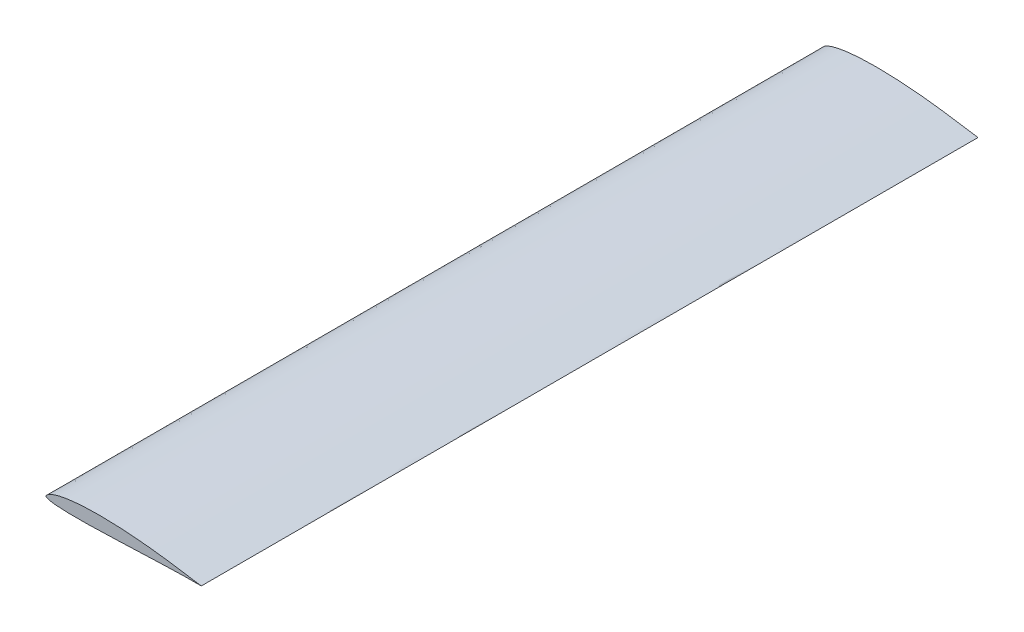
ISO-10303-21;
HEADER;
FILE_DESCRIPTION(('STEP AP214'),'2;1');
FILE_NAME('part.step','',(''),(''),'','','');
FILE_SCHEMA(('AUTOMOTIVE_DESIGN { 1 0 10303 214 1 1 1 1 }'));
ENDSEC;
DATA;
#1=APPLICATION_CONTEXT('core data for automotive mechanical design processes');
#2=APPLICATION_PROTOCOL_DEFINITION('international standard','automotive_design',2000,#1);
#3=PRODUCT_CONTEXT('',#1,'mechanical');
#4=PRODUCT('Part','Part','',(#3));
#5=PRODUCT_RELATED_PRODUCT_CATEGORY('part','',(#4));
#6=PRODUCT_DEFINITION_FORMATION('','',#4);
#7=PRODUCT_DEFINITION_CONTEXT('part definition',#1,'design');
#8=PRODUCT_DEFINITION('design','',#6,#7);
#9=PRODUCT_DEFINITION_SHAPE('','',#8);
#10=(LENGTH_UNIT() NAMED_UNIT(*) SI_UNIT(.MILLI.,.METRE.));
#11=(NAMED_UNIT(*) PLANE_ANGLE_UNIT() SI_UNIT($,.RADIAN.));
#12=(NAMED_UNIT(*) SI_UNIT($,.STERADIAN.) SOLID_ANGLE_UNIT());
#13=UNCERTAINTY_MEASURE_WITH_UNIT(LENGTH_MEASURE(1.E-05),#10,'distance_accuracy_value','');
#14=(GEOMETRIC_REPRESENTATION_CONTEXT(3) GLOBAL_UNCERTAINTY_ASSIGNED_CONTEXT((#13)) GLOBAL_UNIT_ASSIGNED_CONTEXT((#10,
#11,#12)) REPRESENTATION_CONTEXT('',''));
#15=CARTESIAN_POINT('',(0.,0.,0.));
#16=DIRECTION('',(0.,0.,1.));
#17=DIRECTION('',(1.,0.,0.));
#18=AXIS2_PLACEMENT_3D('',#15,#16,#17);
#19=CARTESIAN_POINT('',(0.152421900745486,0.326070947575085,0.));
#20=DIRECTION('',(0.,0.,-1.));
#21=DIRECTION('',(-1.,0.,0.));
#22=AXIS2_PLACEMENT_3D('',#19,#20,#21);
#23=PLANE('',#22);
#24=CARTESIAN_POINT('',(50.,0.,0.));
#25=CARTESIAN_POINT('',(50.0001273205321,0.00242279201757395,0.));
#26=CARTESIAN_POINT('',(49.6521840088656,0.0329586213581371,0.));
#27=CARTESIAN_POINT('',(49.3010972078679,0.0831885092802938,0.));
#28=CARTESIAN_POINT('',(48.4592740042575,0.194453497250842,0.));
#29=CARTESIAN_POINT('',(47.4414796455049,0.349875411204893,0.));
#30=CARTESIAN_POINT('',(46.1337766076312,0.554864153763786,0.));
#31=CARTESIAN_POINT('',(44.61548504643,0.799310741550212,0.));
#32=CARTESIAN_POINT('',(42.892312753215,1.07508556042278,0.));
#33=CARTESIAN_POINT('',(40.9957541480389,1.37098043133005,0.));
#34=CARTESIAN_POINT('',(38.9477175297238,1.67466948244018,0.));
#35=CARTESIAN_POINT('',(36.7703229553684,1.97111561609218,0.));
#36=CARTESIAN_POINT('',(34.4838392458463,2.24976134532858,0.));
#37=CARTESIAN_POINT('',(32.1089909863567,2.50484012757015,0.));
#38=CARTESIAN_POINT('',(29.6686085801485,2.73223984273263,0.));
#39=CARTESIAN_POINT('',(27.1889211643221,2.93178234235765,0.));
#40=CARTESIAN_POINT('',(24.6971414763768,3.09962286666098,0.));
#41=CARTESIAN_POINT('',(22.2188171394647,3.22515516799604,0.));
#42=CARTESIAN_POINT('',(19.7784476370654,3.30480069516153,0.));
#43=CARTESIAN_POINT('',(17.399570259008,3.33876730413773,0.));
#44=CARTESIAN_POINT('',(15.1043181791753,3.3209608777707,0.));
#45=CARTESIAN_POINT('',(12.9137731066449,3.24922988713664,0.));
#46=CARTESIAN_POINT('',(10.8475464138471,3.12961914842588,0.));
#47=CARTESIAN_POINT('',(8.92450970637668,2.95957732669919,0.));
#48=CARTESIAN_POINT('',(7.16128784341364,2.74042886608446,0.));
#49=CARTESIAN_POINT('',(5.57151750585493,2.47671453354688,0.));
#50=CARTESIAN_POINT('',(4.16707882987432,2.17390075017167,0.));
#51=CARTESIAN_POINT('',(2.95762695169971,1.83762559037907,0.));
#52=CARTESIAN_POINT('',(1.95046514173136,1.47726345244253,0.));
#53=CARTESIAN_POINT('',(1.1488164731194,1.10304578750434,0.));
#54=CARTESIAN_POINT('',(0.558729346152352,0.731078994339724,0.));
#55=CARTESIAN_POINT('',(0.228075960717646,0.436603357022112,0.));
#56=CARTESIAN_POINT('',(0.0899921707710676,0.239435058265833,0.));
#57=CARTESIAN_POINT('',(0.0408145747667068,0.152213956619051,0.));
#58=CARTESIAN_POINT('',(0.0104498427942053,0.0738270967810475,0.));
#59=CARTESIAN_POINT('',(-0.00154321203104168,0.0120299064321601,0.));
#60=CARTESIAN_POINT('',(0.000871812243820358,-0.0366659130874011,0.));
#61=CARTESIAN_POINT('',(0.024720092378635,-0.0803785419457888,0.));
#62=CARTESIAN_POINT('',(0.0694179091201762,-0.130458815267373,0.));
#63=CARTESIAN_POINT('',(0.14105047094681,-0.188547481064558,0.));
#64=CARTESIAN_POINT('',(0.314418627664273,-0.296228741008699,0.));
#65=CARTESIAN_POINT('',(0.700511343454124,-0.453609622775309,0.));
#66=CARTESIAN_POINT('',(1.37809381395956,-0.628171653606636,0.));
#67=CARTESIAN_POINT('',(2.33745724684421,-0.787734756121067,0.));
#68=CARTESIAN_POINT('',(3.53896744786107,-0.918209354920351,0.));
#69=CARTESIAN_POINT('',(4.97416794497812,-1.01541081628356,0.));
#70=CARTESIAN_POINT('',(6.63120920300308,-1.0793435198751,0.));
#71=CARTESIAN_POINT('',(8.49561044435645,-1.11065446399736,0.));
#72=CARTESIAN_POINT('',(10.5496690235186,-1.11199123142911,0.));
#73=CARTESIAN_POINT('',(12.7727629501113,-1.08678554760908,0.));
#74=CARTESIAN_POINT('',(15.1414405609385,-1.038931401911,0.));
#75=CARTESIAN_POINT('',(17.6298490171543,-0.972256842199377,0.));
#76=CARTESIAN_POINT('',(20.2103380011535,-0.89056470943051,0.));
#77=CARTESIAN_POINT('',(22.8538200474147,-0.797649565655998,0.));
#78=CARTESIAN_POINT('',(25.5302884922338,-0.696923220419977,0.));
#79=CARTESIAN_POINT('',(28.2090611101534,-0.592479052656274,0.));
#80=CARTESIAN_POINT('',(30.8590409643815,-0.487645246314674,0.));
#81=CARTESIAN_POINT('',(33.4489998510024,-0.386619732218495,0.));
#82=CARTESIAN_POINT('',(35.9478419458797,-0.29237673432343,0.));
#83=CARTESIAN_POINT('',(38.3250166377282,-0.208048772804269,0.));
#84=CARTESIAN_POINT('',(40.5510042661914,-0.135849855230422,0.));
#85=CARTESIAN_POINT('',(42.5963952436551,-0.0784780186568451,0.));
#86=CARTESIAN_POINT('',(44.436055181628,-0.0364613008818633,0.));
#87=CARTESIAN_POINT('',(46.0377523753407,-0.00914858105455184,0.));
#88=CARTESIAN_POINT('',(47.3989816954244,0.00431028092650521,0.));
#89=CARTESIAN_POINT('',(48.4440543669687,0.00956179029864694,0.));
#90=CARTESIAN_POINT('',(49.2972475070281,0.00421127418794704,0.));
#91=CARTESIAN_POINT('',(49.6515010884607,0.00898210223244359,0.));
#92=CARTESIAN_POINT('',(49.9998725644973,-0.0024249798023086,0.));
#93=CARTESIAN_POINT('',(50.,0.,0.));
#94=B_SPLINE_CURVE_WITH_KNOTS('',3,(#24,#25,#26,#27,#28,#29,#30,#31,#32,#33,#34,#35,#36,#37,#38,
#39,#40,#41,#42,#43,#44,#45,#46,#47,#48,#49,#50,#51,#52,#53,#54,#55,#56,#57,#58,#59,#60,#61,#62,
#63,#64,#65,#66,#67,#68,#69,#70,#71,#72,#73,#74,#75,#76,#77,#78,#79,#80,#81,#82,#83,#84,#85,#86,
#87,#88,#89,#90,#91,#92,#93),.UNSPECIFIED.,.T.,.F.,(4,1,1,1,1,1,1,1,1,1,1,1,1,1,1,1,1,1,1,1,1,1,
1,1,1,1,1,1,1,1,1,1,1,1,1,1,1,1,1,1,1,1,1,1,1,1,1,1,1,1,1,1,1,1,1,1,1,1,1,1,1,1,1,1,1,1,1,4),
(0.,0.00163100967529279,0.006435235004734,0.0142206692223634,0.0247656252579182,
0.0378267269580913,0.0531493478862453,0.0704735042826113,0.0895356944216796,0.110075427516268,
0.131859874985406,0.154692567294311,0.178371256169875,0.202679511873491,0.22736396068896,
0.252132687183434,0.276728350590027,0.300939435147841,0.324527110506369,0.347267376957691,
0.368991726016915,0.389507470720742,0.408628379551237,0.426224009291417,0.442178727529928,
0.456395551168158,0.4688051239249,0.479372317511659,0.488085518085538,0.494967923813924,
0.500033810265933,0.501035662602399,0.502094489523219,0.502996978480934,0.503512880218242,
0.503955825590444,0.504408894464655,0.504955422997044,0.50594262600694,0.507129613737027,
0.510997734788642,0.518231918904382,0.52784553190147,0.539808758125613,0.554055914736768,
0.570489591502225,0.588973674400973,0.609342058034304,0.631392896979107,0.654894033520888,
0.679589724771299,0.705203145434866,0.731446603653204,0.758020282196595,0.784619627763923,
0.81093562404957,0.836656652810421,0.861473352283136,0.885081474957591,0.90718794410531,
0.927507338219275,0.945765257215092,0.961711873943494,0.975121793215094,0.985796265959578,
0.993581185210361,0.998367517520586,1.),.UNSPECIFIED.);
#95=CARTESIAN_POINT('',(50.,0.,0.));
#96=VERTEX_POINT('',#95);
#97=EDGE_CURVE('E46',#96,#96,#94,.T.);
#98=ORIENTED_EDGE('',*,*,#97,.F.);
#99=EDGE_LOOP('',(#98));
#100=FACE_BOUND('',#99,.T.);
#101=DIRECTION('',(1.,0.,0.));
#102=VECTOR('',#101,1.);
#103=CARTESIAN_POINT('',(18.473,1.59,0.));
#104=LINE('',#103,#102);
#105=CARTESIAN_POINT('',(15.473,1.59,0.));
#106=VERTEX_POINT('',#105);
#107=CARTESIAN_POINT('',(18.473,1.59,0.));
#108=VERTEX_POINT('',#107);
#109=EDGE_CURVE('E101',#106,#108,#104,.T.);
#110=ORIENTED_EDGE('',*,*,#109,.F.);
#111=DIRECTION('',(0.,1.,0.));
#112=VECTOR('',#111,1.);
#113=CARTESIAN_POINT('',(15.473,1.59,0.));
#114=LINE('',#113,#112);
#115=CARTESIAN_POINT('',(15.473,0.589999999999997,0.));
#116=VERTEX_POINT('',#115);
#117=EDGE_CURVE('E115',#116,#106,#114,.T.);
#118=ORIENTED_EDGE('',*,*,#117,.F.);
#119=DIRECTION('',(-1.,0.,0.));
#120=VECTOR('',#119,1.);
#121=CARTESIAN_POINT('',(18.473,0.589999999999997,0.));
#122=LINE('',#121,#120);
#123=CARTESIAN_POINT('',(18.473,0.589999999999997,0.));
#124=VERTEX_POINT('',#123);
#125=EDGE_CURVE('E81',#124,#116,#122,.T.);
#126=ORIENTED_EDGE('',*,*,#125,.F.);
#127=DIRECTION('',(0.,-1.,0.));
#128=VECTOR('',#127,1.);
#129=CARTESIAN_POINT('',(18.473,1.59,0.));
#130=LINE('',#129,#128);
#131=EDGE_CURVE('E121',#108,#124,#130,.T.);
#132=ORIENTED_EDGE('',*,*,#131,.F.);
#133=EDGE_LOOP('',(#110,#118,#126,#132));
#134=FACE_BOUND('',#133,.T.);
#135=ADVANCED_FACE('F41',(#100,#134),#23,.T.);
#136=CARTESIAN_POINT('',(50.,0.,250.));
#137=CARTESIAN_POINT('',(50.0001273205321,0.00242279201757395,250.));
#138=CARTESIAN_POINT('',(49.6521840088656,0.0329586213581371,250.));
#139=CARTESIAN_POINT('',(49.3010972078679,0.0831885092802938,250.));
#140=CARTESIAN_POINT('',(48.4592740042575,0.194453497250842,250.));
#141=CARTESIAN_POINT('',(47.4414796455049,0.349875411204893,250.));
#142=CARTESIAN_POINT('',(46.1337766076312,0.554864153763786,250.));
#143=CARTESIAN_POINT('',(44.61548504643,0.799310741550212,250.));
#144=CARTESIAN_POINT('',(42.892312753215,1.07508556042278,250.));
#145=CARTESIAN_POINT('',(40.9957541480389,1.37098043133005,250.));
#146=CARTESIAN_POINT('',(38.9477175297238,1.67466948244018,250.));
#147=CARTESIAN_POINT('',(36.7703229553684,1.97111561609218,250.));
#148=CARTESIAN_POINT('',(34.4838392458463,2.24976134532858,250.));
#149=CARTESIAN_POINT('',(32.1089909863567,2.50484012757015,250.));
#150=CARTESIAN_POINT('',(29.6686085801485,2.73223984273263,250.));
#151=CARTESIAN_POINT('',(27.1889211643221,2.93178234235765,250.));
#152=CARTESIAN_POINT('',(24.6971414763768,3.09962286666098,250.));
#153=CARTESIAN_POINT('',(22.2188171394647,3.22515516799604,250.));
#154=CARTESIAN_POINT('',(19.7784476370654,3.30480069516153,250.));
#155=CARTESIAN_POINT('',(17.399570259008,3.33876730413773,250.));
#156=CARTESIAN_POINT('',(15.1043181791753,3.3209608777707,250.));
#157=CARTESIAN_POINT('',(12.9137731066449,3.24922988713664,250.));
#158=CARTESIAN_POINT('',(10.8475464138471,3.12961914842588,250.));
#159=CARTESIAN_POINT('',(8.92450970637668,2.95957732669919,250.));
#160=CARTESIAN_POINT('',(7.16128784341364,2.74042886608446,250.));
#161=CARTESIAN_POINT('',(5.57151750585493,2.47671453354688,250.));
#162=CARTESIAN_POINT('',(4.16707882987432,2.17390075017167,250.));
#163=CARTESIAN_POINT('',(2.95762695169971,1.83762559037907,250.));
#164=CARTESIAN_POINT('',(1.95046514173136,1.47726345244253,250.));
#165=CARTESIAN_POINT('',(1.1488164731194,1.10304578750434,250.));
#166=CARTESIAN_POINT('',(0.558729346152352,0.731078994339724,250.));
#167=CARTESIAN_POINT('',(0.228075960717646,0.436603357022112,250.));
#168=CARTESIAN_POINT('',(0.0899921707710676,0.239435058265833,250.));
#169=CARTESIAN_POINT('',(0.0408145747667068,0.152213956619051,250.));
#170=CARTESIAN_POINT('',(0.0104498427942053,0.0738270967810475,250.));
#171=CARTESIAN_POINT('',(-0.00154321203104168,0.0120299064321601,250.));
#172=CARTESIAN_POINT('',(0.000871812243820358,-0.0366659130874011,250.));
#173=CARTESIAN_POINT('',(0.024720092378635,-0.0803785419457888,250.));
#174=CARTESIAN_POINT('',(0.0694179091201762,-0.130458815267373,250.));
#175=CARTESIAN_POINT('',(0.14105047094681,-0.188547481064558,250.));
#176=CARTESIAN_POINT('',(0.314418627664273,-0.296228741008699,250.));
#177=CARTESIAN_POINT('',(0.700511343454124,-0.453609622775309,250.));
#178=CARTESIAN_POINT('',(1.37809381395956,-0.628171653606636,250.));
#179=CARTESIAN_POINT('',(2.33745724684421,-0.787734756121067,250.));
#180=CARTESIAN_POINT('',(3.53896744786107,-0.918209354920351,250.));
#181=CARTESIAN_POINT('',(4.97416794497812,-1.01541081628356,250.));
#182=CARTESIAN_POINT('',(6.63120920300308,-1.0793435198751,250.));
#183=CARTESIAN_POINT('',(8.49561044435645,-1.11065446399736,250.));
#184=CARTESIAN_POINT('',(10.5496690235186,-1.11199123142911,250.));
#185=CARTESIAN_POINT('',(12.7727629501113,-1.08678554760908,250.));
#186=CARTESIAN_POINT('',(15.1414405609385,-1.038931401911,250.));
#187=CARTESIAN_POINT('',(17.6298490171543,-0.972256842199377,250.));
#188=CARTESIAN_POINT('',(20.2103380011535,-0.89056470943051,250.));
#189=CARTESIAN_POINT('',(22.8538200474147,-0.797649565655998,250.));
#190=CARTESIAN_POINT('',(25.5302884922338,-0.696923220419977,250.));
#191=CARTESIAN_POINT('',(28.2090611101534,-0.592479052656274,250.));
#192=CARTESIAN_POINT('',(30.8590409643815,-0.487645246314674,250.));
#193=CARTESIAN_POINT('',(33.4489998510024,-0.386619732218495,250.));
#194=CARTESIAN_POINT('',(35.9478419458797,-0.29237673432343,250.));
#195=CARTESIAN_POINT('',(38.3250166377282,-0.208048772804269,250.));
#196=CARTESIAN_POINT('',(40.5510042661914,-0.135849855230422,250.));
#197=CARTESIAN_POINT('',(42.5963952436551,-0.0784780186568451,250.));
#198=CARTESIAN_POINT('',(44.436055181628,-0.0364613008818633,250.));
#199=CARTESIAN_POINT('',(46.0377523753407,-0.00914858105455184,250.));
#200=CARTESIAN_POINT('',(47.3989816954244,0.00431028092650521,250.));
#201=CARTESIAN_POINT('',(48.4440543669687,0.00956179029864694,250.));
#202=CARTESIAN_POINT('',(49.2972475070281,0.00421127418794704,250.));
#203=CARTESIAN_POINT('',(49.6515010884607,0.00898210223244359,250.));
#204=CARTESIAN_POINT('',(49.9998725644973,-0.0024249798023086,250.));
#205=CARTESIAN_POINT('',(50.,0.,250.));
#206=B_SPLINE_CURVE_WITH_KNOTS('',3,(#136,#137,#138,#139,#140,#141,#142,#143,#144,#145,#146,
#147,#148,#149,#150,#151,#152,#153,#154,#155,#156,#157,#158,#159,#160,#161,#162,#163,#164,#165,
#166,#167,#168,#169,#170,#171,#172,#173,#174,#175,#176,#177,#178,#179,#180,#181,#182,#183,#184,
#185,#186,#187,#188,#189,#190,#191,#192,#193,#194,#195,#196,#197,#198,#199,#200,#201,#202,#203,
#204,#205),.UNSPECIFIED.,.T.,.F.,(4,1,1,1,1,1,1,1,1,1,1,1,1,1,1,1,1,1,1,1,1,1,1,1,1,1,1,1,1,1,1,
1,1,1,1,1,1,1,1,1,1,1,1,1,1,1,1,1,1,1,1,1,1,1,1,1,1,1,1,1,1,1,1,1,1,1,1,4),(0.,
0.00163100967529279,0.006435235004734,0.0142206692223634,0.0247656252579182,0.0378267269580913,
0.0531493478862453,0.0704735042826113,0.0895356944216796,0.110075427516268,0.131859874985406,
0.154692567294311,0.178371256169875,0.202679511873491,0.22736396068896,0.252132687183434,
0.276728350590027,0.300939435147841,0.324527110506369,0.347267376957691,0.368991726016915,
0.389507470720742,0.408628379551237,0.426224009291417,0.442178727529928,0.456395551168158,
0.4688051239249,0.479372317511659,0.488085518085538,0.494967923813924,0.500033810265933,
0.501035662602399,0.502094489523219,0.502996978480934,0.503512880218242,0.503955825590444,
0.504408894464655,0.504955422997044,0.50594262600694,0.507129613737027,0.510997734788642,
0.518231918904382,0.52784553190147,0.539808758125613,0.554055914736768,0.570489591502225,
0.588973674400973,0.609342058034304,0.631392896979107,0.654894033520888,0.679589724771299,
0.705203145434866,0.731446603653204,0.758020282196595,0.784619627763923,0.81093562404957,
0.836656652810421,0.861473352283136,0.885081474957591,0.90718794410531,0.927507338219275,
0.945765257215092,0.961711873943494,0.975121793215094,0.985796265959578,0.993581185210361,
0.998367517520586,1.),.UNSPECIFIED.);
#207=DIRECTION('',(0.,0.,-1.));
#208=VECTOR('',#207,1.);
#209=SURFACE_OF_LINEAR_EXTRUSION('',#206,#208);
#210=CARTESIAN_POINT('',(50.,0.,250.));
#211=VERTEX_POINT('',#210);
#212=EDGE_CURVE('E11',#211,#211,#206,.T.);
#213=ORIENTED_EDGE('',*,*,#212,.F.);
#214=EDGE_LOOP('',(#213));
#215=FACE_BOUND('',#214,.T.);
#216=ORIENTED_EDGE('',*,*,#97,.T.);
#217=EDGE_LOOP('',(#216));
#218=FACE_BOUND('',#217,.T.);
#219=ADVANCED_FACE('F43',(#215,#218),#209,.F.);
#220=CARTESIAN_POINT('',(0.152421900745486,0.326070947575085,250.));
#221=DIRECTION('',(0.,0.,-1.));
#222=DIRECTION('',(-1.,0.,0.));
#223=AXIS2_PLACEMENT_3D('',#220,#221,#222);
#224=PLANE('',#223);
#225=ORIENTED_EDGE('',*,*,#212,.T.);
#226=EDGE_LOOP('',(#225));
#227=FACE_BOUND('',#226,.T.);
#228=ADVANCED_FACE('F161',(#227),#224,.F.);
#229=CARTESIAN_POINT('',(15.473,1.59,-1.));
#230=DIRECTION('',(1.,0.,0.));
#231=DIRECTION('',(0.,0.,-1.));
#232=AXIS2_PLACEMENT_3D('',#229,#230,#231);
#233=PLANE('',#232);
#234=ORIENTED_EDGE('',*,*,#117,.T.);
#235=DIRECTION('',(0.,0.,1.));
#236=VECTOR('',#235,1.);
#237=CARTESIAN_POINT('',(15.473,1.59,-1.));
#238=LINE('',#237,#236);
#239=CARTESIAN_POINT('',(15.473,1.59,-1.));
#240=VERTEX_POINT('',#239);
#241=EDGE_CURVE('E105',#240,#106,#238,.T.);
#242=ORIENTED_EDGE('',*,*,#241,.F.);
#243=DIRECTION('',(0.,1.,0.));
#244=VECTOR('',#243,1.);
#245=CARTESIAN_POINT('',(15.473,1.59,-1.));
#246=LINE('',#245,#244);
#247=CARTESIAN_POINT('',(15.473,0.589999999999997,-1.));
#248=VERTEX_POINT('',#247);
#249=EDGE_CURVE('E93',#248,#240,#246,.T.);
#250=ORIENTED_EDGE('',*,*,#249,.F.);
#251=DIRECTION('',(0.,0.,1.));
#252=VECTOR('',#251,1.);
#253=CARTESIAN_POINT('',(15.473,0.589999999999997,-1.));
#254=LINE('',#253,#252);
#255=EDGE_CURVE('E111',#248,#116,#254,.T.);
#256=ORIENTED_EDGE('',*,*,#255,.T.);
#257=EDGE_LOOP('',(#234,#242,#250,#256));
#258=FACE_BOUND('',#257,.T.);
#259=ADVANCED_FACE('F146',(#258),#233,.F.);
#260=CARTESIAN_POINT('',(18.473,1.59,-1.));
#261=DIRECTION('',(0.,-1.,0.));
#262=DIRECTION('',(0.,0.,-1.));
#263=AXIS2_PLACEMENT_3D('',#260,#261,#262);
#264=PLANE('',#263);
#265=ORIENTED_EDGE('',*,*,#109,.T.);
#266=DIRECTION('',(0.,0.,1.));
#267=VECTOR('',#266,1.);
#268=CARTESIAN_POINT('',(18.473,1.59,-1.));
#269=LINE('',#268,#267);
#270=CARTESIAN_POINT('',(18.473,1.59,-1.));
#271=VERTEX_POINT('',#270);
#272=EDGE_CURVE('E98',#271,#108,#269,.T.);
#273=ORIENTED_EDGE('',*,*,#272,.F.);
#274=DIRECTION('',(1.,0.,0.));
#275=VECTOR('',#274,1.);
#276=CARTESIAN_POINT('',(18.473,1.59,-1.));
#277=LINE('',#276,#275);
#278=EDGE_CURVE('E88',#240,#271,#277,.T.);
#279=ORIENTED_EDGE('',*,*,#278,.F.);
#280=ORIENTED_EDGE('',*,*,#241,.T.);
#281=EDGE_LOOP('',(#265,#273,#279,#280));
#282=FACE_BOUND('',#281,.T.);
#283=ADVANCED_FACE('F99',(#282),#264,.F.);
#284=CARTESIAN_POINT('',(18.473,1.59,-1.));
#285=DIRECTION('',(-1.,0.,0.));
#286=DIRECTION('',(0.,0.,1.));
#287=AXIS2_PLACEMENT_3D('',#284,#285,#286);
#288=PLANE('',#287);
#289=ORIENTED_EDGE('',*,*,#131,.T.);
#290=DIRECTION('',(0.,0.,1.));
#291=VECTOR('',#290,1.);
#292=CARTESIAN_POINT('',(18.473,0.589999999999997,-1.));
#293=LINE('',#292,#291);
#294=CARTESIAN_POINT('',(18.473,0.589999999999997,-1.));
#295=VERTEX_POINT('',#294);
#296=EDGE_CURVE('E59',#295,#124,#293,.T.);
#297=ORIENTED_EDGE('',*,*,#296,.F.);
#298=DIRECTION('',(0.,-1.,0.));
#299=VECTOR('',#298,1.);
#300=CARTESIAN_POINT('',(18.473,1.59,-1.));
#301=LINE('',#300,#299);
#302=EDGE_CURVE('E91',#271,#295,#301,.T.);
#303=ORIENTED_EDGE('',*,*,#302,.F.);
#304=ORIENTED_EDGE('',*,*,#272,.T.);
#305=EDGE_LOOP('',(#289,#297,#303,#304));
#306=FACE_BOUND('',#305,.T.);
#307=ADVANCED_FACE('F107',(#306),#288,.F.);
#308=CARTESIAN_POINT('',(18.473,0.589999999999997,-1.));
#309=DIRECTION('',(0.,1.,0.));
#310=DIRECTION('',(0.,0.,1.));
#311=AXIS2_PLACEMENT_3D('',#308,#309,#310);
#312=PLANE('',#311);
#313=ORIENTED_EDGE('',*,*,#125,.T.);
#314=ORIENTED_EDGE('',*,*,#255,.F.);
#315=DIRECTION('',(-1.,0.,0.));
#316=VECTOR('',#315,1.);
#317=CARTESIAN_POINT('',(18.473,0.589999999999997,-1.));
#318=LINE('',#317,#316);
#319=EDGE_CURVE('E67',#295,#248,#318,.T.);
#320=ORIENTED_EDGE('',*,*,#319,.F.);
#321=ORIENTED_EDGE('',*,*,#296,.T.);
#322=EDGE_LOOP('',(#313,#314,#320,#321));
#323=FACE_BOUND('',#322,.T.);
#324=ADVANCED_FACE('F147',(#323),#312,.F.);
#325=CARTESIAN_POINT('',(0.,0.,-1.));
#326=DIRECTION('',(0.,0.,-1.));
#327=DIRECTION('',(-1.,0.,0.));
#328=AXIS2_PLACEMENT_3D('',#325,#326,#327);
#329=PLANE('',#328);
#330=ORIENTED_EDGE('',*,*,#249,.T.);
#331=ORIENTED_EDGE('',*,*,#278,.T.);
#332=ORIENTED_EDGE('',*,*,#302,.T.);
#333=ORIENTED_EDGE('',*,*,#319,.T.);
#334=EDGE_LOOP('',(#330,#331,#332,#333));
#335=FACE_BOUND('',#334,.T.);
#336=ADVANCED_FACE('F89',(#335),#329,.T.);
#337=CLOSED_SHELL('',(#135,#219,#228,#259,#283,#307,#324,#336));
#338=MANIFOLD_SOLID_BREP('B2',#337);
#339=ADVANCED_BREP_SHAPE_REPRESENTATION('',(#18,#338),#14);
#340=SHAPE_DEFINITION_REPRESENTATION(#9,#339);
ENDSEC;
END-ISO-10303-21;
